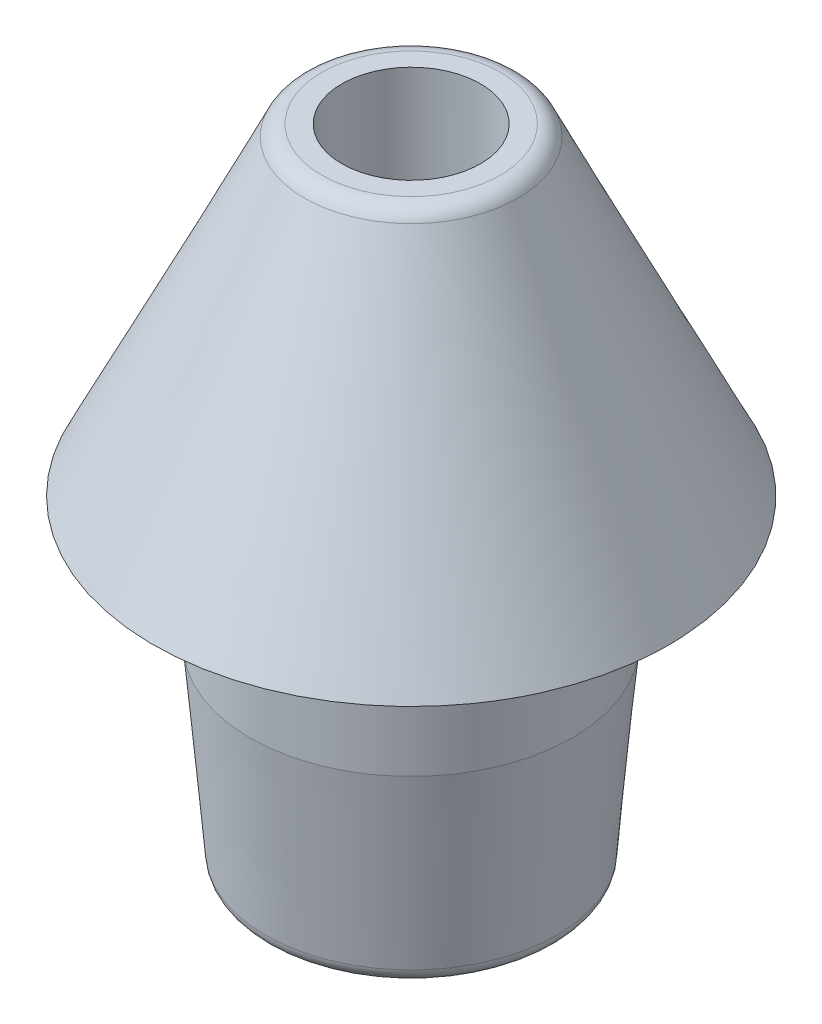
ISO-10303-21;
HEADER;
FILE_DESCRIPTION(('STEP AP214'),'2;1');
FILE_NAME('part.step','',(''),(''),'','','');
FILE_SCHEMA(('AUTOMOTIVE_DESIGN { 1 0 10303 214 1 1 1 1 }'));
ENDSEC;
DATA;
#1=APPLICATION_CONTEXT('core data for automotive mechanical design processes');
#2=APPLICATION_PROTOCOL_DEFINITION('international standard','automotive_design',2000,#1);
#3=PRODUCT_CONTEXT('',#1,'mechanical');
#4=PRODUCT('Part','Part','',(#3));
#5=PRODUCT_RELATED_PRODUCT_CATEGORY('part','',(#4));
#6=PRODUCT_DEFINITION_FORMATION('','',#4);
#7=PRODUCT_DEFINITION_CONTEXT('part definition',#1,'design');
#8=PRODUCT_DEFINITION('design','',#6,#7);
#9=PRODUCT_DEFINITION_SHAPE('','',#8);
#10=(LENGTH_UNIT() NAMED_UNIT(*) SI_UNIT(.MILLI.,.METRE.));
#11=(NAMED_UNIT(*) PLANE_ANGLE_UNIT() SI_UNIT($,.RADIAN.));
#12=(NAMED_UNIT(*) SI_UNIT($,.STERADIAN.) SOLID_ANGLE_UNIT());
#13=UNCERTAINTY_MEASURE_WITH_UNIT(LENGTH_MEASURE(1.E-05),#10,'distance_accuracy_value','');
#14=(GEOMETRIC_REPRESENTATION_CONTEXT(3) GLOBAL_UNCERTAINTY_ASSIGNED_CONTEXT((#13)) GLOBAL_UNIT_ASSIGNED_CONTEXT((#10,
#11,#12)) REPRESENTATION_CONTEXT('',''));
#15=CARTESIAN_POINT('',(0.,0.,0.));
#16=DIRECTION('',(0.,0.,1.));
#17=DIRECTION('',(1.,0.,0.));
#18=AXIS2_PLACEMENT_3D('',#15,#16,#17);
#19=CARTESIAN_POINT('',(0.,5.,0.));
#20=DIRECTION('',(0.,-1.,0.));
#21=DIRECTION('',(0.,0.,-1.));
#22=AXIS2_PLACEMENT_3D('',#19,#20,#21);
#23=CYLINDRICAL_SURFACE('',#22,2.5);
#24=CARTESIAN_POINT('',(0.,4.75,0.));
#25=DIRECTION('',(0.,1.,0.));
#26=DIRECTION('',(0.,0.,1.));
#27=AXIS2_PLACEMENT_3D('',#24,#25,#26);
#28=CIRCLE('',#27,2.5);
#29=CARTESIAN_POINT('',(0.,4.75,2.5));
#30=VERTEX_POINT('',#29);
#31=EDGE_CURVE('E59',#30,#30,#28,.F.);
#32=ORIENTED_EDGE('',*,*,#31,.T.);
#33=EDGE_LOOP('',(#32));
#34=FACE_BOUND('',#33,.T.);
#35=CARTESIAN_POINT('',(0.,3.00000000000009,0.));
#36=DIRECTION('',(0.,1.,0.));
#37=DIRECTION('',(0.,0.,1.));
#38=AXIS2_PLACEMENT_3D('',#35,#36,#37);
#39=CIRCLE('',#38,2.5);
#40=CARTESIAN_POINT('',(0.,3.00000000000009,2.5));
#41=VERTEX_POINT('',#40);
#42=EDGE_CURVE('E71',#41,#41,#39,.T.);
#43=ORIENTED_EDGE('',*,*,#42,.T.);
#44=EDGE_LOOP('',(#43));
#45=FACE_BOUND('',#44,.T.);
#46=ADVANCED_FACE('F39',(#34,#45),#23,.T.);
#47=CARTESIAN_POINT('',(0.,0.,0.));
#48=DIRECTION('',(0.,1.,0.));
#49=DIRECTION('',(0.,0.,1.));
#50=AXIS2_PLACEMENT_3D('',#47,#48,#49);
#51=PLANE('',#50);
#52=CARTESIAN_POINT('',(0.,0.,0.));
#53=DIRECTION('',(0.,1.,0.));
#54=DIRECTION('',(0.,0.,1.));
#55=AXIS2_PLACEMENT_3D('',#52,#53,#54);
#56=CIRCLE('',#55,1.61224114167871);
#57=CARTESIAN_POINT('',(0.,0.,1.61224114167871));
#58=VERTEX_POINT('',#57);
#59=EDGE_CURVE('E50',#58,#58,#56,.T.);
#60=ORIENTED_EDGE('',*,*,#59,.T.);
#61=EDGE_LOOP('',(#60));
#62=FACE_BOUND('',#61,.T.);
#63=CARTESIAN_POINT('',(0.,0.,0.));
#64=DIRECTION('',(0.,1.,0.));
#65=DIRECTION('',(0.,0.,1.));
#66=AXIS2_PLACEMENT_3D('',#63,#64,#65);
#67=CIRCLE('',#66,2.00845121591787);
#68=CARTESIAN_POINT('',(0.,0.,2.00845121591787));
#69=VERTEX_POINT('',#68);
#70=EDGE_CURVE('E54',#69,#69,#67,.F.);
#71=ORIENTED_EDGE('',*,*,#70,.T.);
#72=EDGE_LOOP('',(#71));
#73=FACE_BOUND('',#72,.T.);
#74=ADVANCED_FACE('F98',(#62,#73),#51,.F.);
#75=CARTESIAN_POINT('',(0.,5.,0.));
#76=DIRECTION('',(0.,1.,0.));
#77=DIRECTION('',(0.,0.,1.));
#78=AXIS2_PLACEMENT_3D('',#75,#76,#77);
#79=PLANE('',#78);
#80=CARTESIAN_POINT('',(0.,5.,0.));
#81=DIRECTION('',(0.,1.,0.));
#82=DIRECTION('',(0.,0.,1.));
#83=AXIS2_PLACEMENT_3D('',#80,#81,#82);
#84=CIRCLE('',#83,2.75);
#85=CARTESIAN_POINT('',(0.,5.,2.75));
#86=VERTEX_POINT('',#85);
#87=EDGE_CURVE('E62',#86,#86,#84,.T.);
#88=ORIENTED_EDGE('',*,*,#87,.T.);
#89=EDGE_LOOP('',(#88));
#90=FACE_BOUND('',#89,.T.);
#91=CARTESIAN_POINT('',(0.,5.,0.));
#92=DIRECTION('',(0.,1.,0.));
#93=DIRECTION('',(0.,0.,1.));
#94=AXIS2_PLACEMENT_3D('',#91,#92,#93);
#95=CIRCLE('',#94,4.);
#96=CARTESIAN_POINT('',(-3.8439673327907,5.,-1.10630698471897));
#97=VERTEX_POINT('',#96);
#98=EDGE_CURVE('E77',#97,#97,#95,.T.);
#99=ORIENTED_EDGE('',*,*,#98,.F.);
#100=EDGE_LOOP('',(#99));
#101=FACE_BOUND('',#100,.T.);
#102=ADVANCED_FACE('F89',(#90,#101),#79,.F.);
#103=CARTESIAN_POINT('',(0.,10.,0.));
#104=DIRECTION('',(0.,1.,0.));
#105=DIRECTION('',(0.,0.,1.));
#106=AXIS2_PLACEMENT_3D('',#103,#104,#105);
#107=PLANE('',#106);
#108=CARTESIAN_POINT('',(0.,10.,0.));
#109=DIRECTION('',(0.,1.,0.));
#110=DIRECTION('',(0.,0.,1.));
#111=AXIS2_PLACEMENT_3D('',#108,#109,#110);
#112=CIRCLE('',#111,1.384424869723);
#113=CARTESIAN_POINT('',(0.,10.,1.384424869723));
#114=VERTEX_POINT('',#113);
#115=EDGE_CURVE('E68',#114,#114,#112,.T.);
#116=ORIENTED_EDGE('',*,*,#115,.T.);
#117=EDGE_LOOP('',(#116));
#118=FACE_BOUND('',#117,.T.);
#119=CARTESIAN_POINT('',(0.,10.,0.));
#120=DIRECTION('',(0.,1.,0.));
#121=DIRECTION('',(0.,0.,1.));
#122=AXIS2_PLACEMENT_3D('',#119,#120,#121);
#123=CIRCLE('',#122,1.075);
#124=CARTESIAN_POINT('',(0.,10.,1.075));
#125=VERTEX_POINT('',#124);
#126=EDGE_CURVE('E80',#125,#125,#123,.T.);
#127=ORIENTED_EDGE('',*,*,#126,.F.);
#128=EDGE_LOOP('',(#127));
#129=FACE_BOUND('',#128,.T.);
#130=ADVANCED_FACE('F86',(#118,#129),#107,.T.);
#131=CARTESIAN_POINT('',(-1.39239365673616,10.,-0.736114736084607));
#132=CARTESIAN_POINT('',(-3.8439673327907,5.,-1.10630698471897));
#133=CARTESIAN_POINT('',(0.0798358154330552,10.,-3.52090204955692));
#134=CARTESIAN_POINT('',(-1.63135336335275,5.,-8.79424165030036));
#135=CARTESIAN_POINT('',(2.86462312890537,10.,-2.04867257738771));
#136=CARTESIAN_POINT('',(6.05658130222864,5.,-6.58162768086242));
#137=CARTESIAN_POINT('',(1.39239365673616,10.,0.736114736084607));
#138=CARTESIAN_POINT('',(3.8439673327907,5.,1.10630698471897));
#139=CARTESIAN_POINT('',(-0.0798358154330547,10.,3.52090204955692));
#140=CARTESIAN_POINT('',(1.63135336335275,5.,8.79424165030036));
#141=CARTESIAN_POINT('',(-2.86462312890537,10.,2.04867257738771));
#142=CARTESIAN_POINT('',(-6.05658130222864,5.,6.58162768086242));
#143=CARTESIAN_POINT('',(-1.39239365673616,10.,-0.736114736084607));
#144=CARTESIAN_POINT('',(-3.8439673327907,5.,-1.10630698471897));
#145=(BOUNDED_SURFACE() B_SPLINE_SURFACE(3,1,((#131,#132),(#133,#134),(#135,#136),(#137,#138),
(#139,#140),(#141,#142),(#143,#144)),.UNSPECIFIED.,.T.,.F.,.F.) B_SPLINE_SURFACE_WITH_KNOTS((4,
3,4),(2,2),(0.,0.5,1.),(0.,1.),
.UNSPECIFIED.) GEOMETRIC_REPRESENTATION_ITEM() RATIONAL_B_SPLINE_SURFACE(((1.,1.),
(0.333333333333333,0.333333333333333),(0.333333333333333,0.333333333333333),(1.,1.),
(0.333333333333333,0.333333333333333),(0.333333333333333,0.333333333333333),(1.,1.))) REPRESENTATION_ITEM('') SURFACE());
#146=CARTESIAN_POINT('',(0.,9.82778405628968,0.));
#147=DIRECTION('',(0.,-1.,0.));
#148=DIRECTION('',(0.,0.,-1.));
#149=AXIS2_PLACEMENT_3D('',#146,#147,#148);
#150=CIRCLE('',#149,1.65584932506583);
#151=CARTESIAN_POINT('',(-1.47683367157558,9.82778405628968,-0.748865337575169));
#152=VERTEX_POINT('',#151);
#153=EDGE_CURVE('E65',#152,#152,#150,.T.);
#154=CARTESIAN_POINT('',(-1.47683367157558,9.82778405628968,-0.748865337575169));
#155=CARTESIAN_POINT('',(-1.5014913138799,9.77749463903666,-0.75258868806625));
#156=CARTESIAN_POINT('',(-1.52614895618423,9.72720522178365,-0.756312038557332));
#157=CARTESIAN_POINT('',(-1.57546424079288,9.62662638727761,-0.763758739539494));
#158=CARTESIAN_POINT('',(-1.6001218830972,9.5763369700246,-0.767482090030576));
#159=CARTESIAN_POINT('',(-1.64943716770585,9.47575813551856,-0.774928791012738));
#160=CARTESIAN_POINT('',(-1.67409481001017,9.42546871826554,-0.778652141503819));
#161=CARTESIAN_POINT('',(-1.72341009461882,9.32488988375951,-0.786098842485982));
#162=CARTESIAN_POINT('',(-1.74806773692314,9.27460046650649,-0.789822192977063));
#163=CARTESIAN_POINT('',(-1.79738302153179,9.17402163200046,-0.797268893959226));
#164=CARTESIAN_POINT('',(-1.82204066383612,9.12373221474744,-0.800992244450307));
#165=CARTESIAN_POINT('',(-1.87135594844477,9.0231533802414,-0.80843894543247));
#166=CARTESIAN_POINT('',(-1.89601359074909,8.97286396298838,-0.812162295923551));
#167=CARTESIAN_POINT('',(-1.94532887535774,8.87228512848235,-0.819608996905713));
#168=CARTESIAN_POINT('',(-1.96998651766206,8.82199571122933,-0.823332347396795));
#169=CARTESIAN_POINT('',(-2.01930180227071,8.7214168767233,-0.830779048378957));
#170=CARTESIAN_POINT('',(-2.04395944457504,8.67112745947028,-0.834502398870039));
#171=CARTESIAN_POINT('',(-2.09327472918368,8.57054862496424,-0.841949099852201));
#172=CARTESIAN_POINT('',(-2.11793237148801,8.52025920771123,-0.845672450343282));
#173=CARTESIAN_POINT('',(-2.16724765609665,8.41968037320519,-0.853119151325445));
#174=CARTESIAN_POINT('',(-2.19190529840098,8.36939095595217,-0.856842501816526));
#175=CARTESIAN_POINT('',(-2.24122058300963,8.26881212144614,-0.864289202798689));
#176=CARTESIAN_POINT('',(-2.26587822531395,8.21852270419312,-0.86801255328977));
#177=CARTESIAN_POINT('',(-2.3151935099226,8.11794386968709,-0.875459254271932));
#178=CARTESIAN_POINT('',(-2.33985115222692,8.06765445243407,-0.879182604763014));
#179=CARTESIAN_POINT('',(-2.38916643683557,7.96707561792803,-0.886629305745176));
#180=CARTESIAN_POINT('',(-2.4138240791399,7.91678620067502,-0.890352656236258));
#181=CARTESIAN_POINT('',(-2.46313936374854,7.81620736616898,-0.89779935721842));
#182=CARTESIAN_POINT('',(-2.48779700605287,7.76591794891596,-0.901522707709501));
#183=CARTESIAN_POINT('',(-2.53711229066152,7.66533911440993,-0.908969408691664));
#184=CARTESIAN_POINT('',(-2.56176993296584,7.61504969715691,-0.912692759182745));
#185=CARTESIAN_POINT('',(-2.61108521757449,7.51447086265088,-0.920139460164908));
#186=CARTESIAN_POINT('',(-2.63574285987881,7.46418144539786,-0.923862810655989));
#187=CARTESIAN_POINT('',(-2.68505814448746,7.36360261089182,-0.931309511638152));
#188=CARTESIAN_POINT('',(-2.70971578679179,7.31331319363881,-0.935032862129233));
#189=CARTESIAN_POINT('',(-2.75903107140043,7.21273435913277,-0.942479563111395));
#190=CARTESIAN_POINT('',(-2.78368871370476,7.16244494187975,-0.946202913602477));
#191=CARTESIAN_POINT('',(-2.83300399831341,7.06186610737372,-0.953649614584639));
#192=CARTESIAN_POINT('',(-2.85766164061773,7.0115766901207,-0.957372965075721));
#193=CARTESIAN_POINT('',(-2.90697692522638,6.91099785561467,-0.964819666057883));
#194=CARTESIAN_POINT('',(-2.9316345675307,6.86070843836165,-0.968543016548965));
#195=CARTESIAN_POINT('',(-2.98094985213935,6.76012960385561,-0.975989717531127));
#196=CARTESIAN_POINT('',(-3.00560749444368,6.7098401866026,-0.979713068022208));
#197=CARTESIAN_POINT('',(-3.05492277905232,6.60926135209656,-0.987159769004371));
#198=CARTESIAN_POINT('',(-3.07958042135665,6.55897193484354,-0.990883119495452));
#199=CARTESIAN_POINT('',(-3.1288957059653,6.45839310033751,-0.998329820477615));
#200=CARTESIAN_POINT('',(-3.15355334826962,6.40810368308449,-1.0020531709687));
#201=CARTESIAN_POINT('',(-3.20286863287827,6.30752484857846,-1.00949987195086));
#202=CARTESIAN_POINT('',(-3.22752627518259,6.25723543132544,-1.01322322244194));
#203=CARTESIAN_POINT('',(-3.27684155979124,6.1566565968194,-1.0206699234241));
#204=CARTESIAN_POINT('',(-3.30149920209557,6.10636717956639,-1.02439327391518));
#205=CARTESIAN_POINT('',(-3.35081448670421,6.00578834506035,-1.03183997489735));
#206=CARTESIAN_POINT('',(-3.37547212900854,5.95549892780733,-1.03556332538843));
#207=CARTESIAN_POINT('',(-3.42478741361719,5.8549200933013,-1.04301002637059));
#208=CARTESIAN_POINT('',(-3.44944505592151,5.80463067604828,-1.04673337686167));
#209=CARTESIAN_POINT('',(-3.49876034053016,5.70405184154225,-1.05418007784383));
#210=CARTESIAN_POINT('',(-3.52341798283448,5.65376242428923,-1.05790342833492));
#211=CARTESIAN_POINT('',(-3.57273326744313,5.55318358978319,-1.06535012931708));
#212=CARTESIAN_POINT('',(-3.59739090974745,5.50289417253018,-1.06907347980816));
#213=CARTESIAN_POINT('',(-3.6467061943561,5.40231533802414,-1.07652018079032));
#214=CARTESIAN_POINT('',(-3.67136383666043,5.35202592077112,-1.0802435312814));
#215=CARTESIAN_POINT('',(-3.72067912126908,5.25144708626509,-1.08769023226357));
#216=CARTESIAN_POINT('',(-3.7453367635734,5.20115766901207,-1.09141358275465));
#217=CARTESIAN_POINT('',(-3.79465204818205,5.10057883450604,-1.09886028373681));
#218=CARTESIAN_POINT('',(-3.81930969048637,5.05028941725302,-1.10258363422789));
#219=CARTESIAN_POINT('',(-3.8439673327907,5.,-1.10630698471897));
#220=B_SPLINE_CURVE_WITH_KNOTS('',3,(#154,#155,#156,#157,#158,#159,#160,#161,#162,#163,#164,
#165,#166,#167,#168,#169,#170,#171,#172,#173,#174,#175,#176,#177,#178,#179,#180,#181,#182,#183,
#184,#185,#186,#187,#188,#189,#190,#191,#192,#193,#194,#195,#196,#197,#198,#199,#200,#201,#202,
#203,#204,#205,#206,#207,#208,#209,#210,#211,#212,#213,#214,#215,#216,#217,#218,#219),
.UNSPECIFIED.,.F.,.F.,(4,2,2,2,2,2,2,2,2,2,2,2,2,2,2,2,2,2,2,2,2,2,2,2,2,2,2,2,2,2,2,2,4),(0.,
0.168398317553411,0.336796635106821,0.505194952660235,0.673593270213646,0.841991587767058,
1.01038990532047,1.17878822287388,1.34718654042729,1.51558485798071,1.68398317553412,
1.85238149308753,2.02077981064094,2.18917812819435,2.35757644574777,2.52597476330118,
2.69437308085459,2.862771398408,3.03116971596141,3.19956803351482,3.36796635106824,
3.53636466862165,3.70476298617506,3.87316130372847,4.04155962128188,4.2099579388353,
4.37835625638871,4.54675457394212,4.71515289149553,4.88355120904894,5.05194952660236,
5.22034784415577,5.38874616170918),.UNSPECIFIED.);
#221=EDGE_CURVE('BSEAM88',#152,#97,#220,.T.);
#222=ORIENTED_EDGE('',*,*,#153,.T.);
#223=ORIENTED_EDGE('',*,*,#98,.T.);
#224=ORIENTED_EDGE('',*,*,#221,.T.);
#225=ORIENTED_EDGE('',*,*,#221,.F.);
#226=EDGE_LOOP('',(#222,#224,#223,#225));
#227=FACE_BOUND('',#226,.T.);
#228=ADVANCED_FACE('F88',(#227),#145,.T.);
#229=CARTESIAN_POINT('',(0.,0.,0.));
#230=DIRECTION('',(0.,1.,0.));
#231=DIRECTION('',(0.,0.,1.));
#232=AXIS2_PLACEMENT_3D('',#229,#230,#231);
#233=CYLINDRICAL_SURFACE('',#232,1.075);
#234=CARTESIAN_POINT('',(0.,5.72434100631815,0.));
#235=DIRECTION('',(0.,1.,0.));
#236=DIRECTION('',(0.,0.,1.));
#237=AXIS2_PLACEMENT_3D('',#234,#235,#236);
#238=CIRCLE('',#237,1.075);
#239=CARTESIAN_POINT('',(0.,5.72434100631815,1.075));
#240=VERTEX_POINT('',#239);
#241=EDGE_CURVE('E74',#240,#240,#238,.F.);
#242=ORIENTED_EDGE('',*,*,#241,.T.);
#243=EDGE_LOOP('',(#242));
#244=FACE_BOUND('',#243,.T.);
#245=ORIENTED_EDGE('',*,*,#126,.T.);
#246=EDGE_LOOP('',(#245));
#247=FACE_BOUND('',#246,.T.);
#248=ADVANCED_FACE('F84',(#244,#247),#233,.F.);
#249=CARTESIAN_POINT('',(0.,0.,0.));
#250=DIRECTION('',(0.,-1.,0.));
#251=DIRECTION('',(0.,0.,-1.));
#252=AXIS2_PLACEMENT_3D('',#249,#250,#251);
#253=CONICAL_SURFACE('',#252,1.37499999999999,0.0523598775598306);
#254=CARTESIAN_POINT('',(0.,0.236916010939264,0.));
#255=DIRECTION('',(0.,-1.,0.));
#256=DIRECTION('',(0.,0.,-1.));
#257=AXIS2_PLACEMENT_3D('',#254,#255,#256);
#258=CIRCLE('',#257,1.36258375799006);
#259=CARTESIAN_POINT('',(0.,0.236916010939264,-1.36258375799006));
#260=VERTEX_POINT('',#259);
#261=EDGE_CURVE('E46',#260,#260,#258,.T.);
#262=ORIENTED_EDGE('',*,*,#261,.T.);
#263=EDGE_LOOP('',(#262));
#264=FACE_BOUND('',#263,.T.);
#265=ORIENTED_EDGE('',*,*,#241,.F.);
#266=EDGE_LOOP('',(#265));
#267=FACE_BOUND('',#266,.T.);
#268=ADVANCED_FACE('F112',(#264,#267),#253,.F.);
#269=CARTESIAN_POINT('',(0.,3.00000000000009,0.));
#270=DIRECTION('',(0.,1.,0.));
#271=DIRECTION('',(0.,0.,1.));
#272=AXIS2_PLACEMENT_3D('',#269,#270,#271);
#273=CONICAL_SURFACE('',#272,2.5,0.0872664625997141);
#274=CARTESIAN_POINT('',(0.,0.228211064313086,0.));
#275=DIRECTION('',(0.,1.,0.));
#276=DIRECTION('',(0.,0.,1.));
#277=AXIS2_PLACEMENT_3D('',#274,#275,#276);
#278=CIRCLE('',#277,2.25749989044081);
#279=CARTESIAN_POINT('',(0.,0.228211064313086,2.25749989044081));
#280=VERTEX_POINT('',#279);
#281=EDGE_CURVE('E11',#280,#280,#278,.T.);
#282=ORIENTED_EDGE('',*,*,#281,.T.);
#283=EDGE_LOOP('',(#282));
#284=FACE_BOUND('',#283,.T.);
#285=ORIENTED_EDGE('',*,*,#42,.F.);
#286=EDGE_LOOP('',(#285));
#287=FACE_BOUND('',#286,.T.);
#288=ADVANCED_FACE('F115',(#284,#287),#273,.T.);
#289=CARTESIAN_POINT('',(0.,9.7,0.));
#290=DIRECTION('',(0.,-1.,0.));
#291=DIRECTION('',(0.,0.,-1.));
#292=AXIS2_PLACEMENT_3D('',#289,#290,#291);
#293=TOROIDAL_SURFACE('',#292,1.384424869723,0.3);
#294=ORIENTED_EDGE('',*,*,#153,.F.);
#295=EDGE_LOOP('',(#294));
#296=FACE_BOUND('',#295,.T.);
#297=ORIENTED_EDGE('',*,*,#115,.F.);
#298=EDGE_LOOP('',(#297));
#299=FACE_BOUND('',#298,.T.);
#300=ADVANCED_FACE('F118',(#296,#299),#293,.T.);
#301=CARTESIAN_POINT('',(0.,4.75,0.));
#302=DIRECTION('',(0.,1.,0.));
#303=DIRECTION('',(0.,0.,1.));
#304=AXIS2_PLACEMENT_3D('',#301,#302,#303);
#305=TOROIDAL_SURFACE('',#304,2.75,0.25);
#306=ORIENTED_EDGE('',*,*,#31,.F.);
#307=EDGE_LOOP('',(#306));
#308=FACE_BOUND('',#307,.T.);
#309=ORIENTED_EDGE('',*,*,#87,.F.);
#310=EDGE_LOOP('',(#309));
#311=FACE_BOUND('',#310,.T.);
#312=ADVANCED_FACE('F121',(#308,#311),#305,.F.);
#313=CARTESIAN_POINT('',(0.,0.25,0.));
#314=DIRECTION('',(0.,1.,0.));
#315=DIRECTION('',(0.,0.,1.));
#316=AXIS2_PLACEMENT_3D('',#313,#314,#315);
#317=TOROIDAL_SURFACE('',#316,1.61224114167871,0.25);
#318=ORIENTED_EDGE('',*,*,#261,.F.);
#319=EDGE_LOOP('',(#318));
#320=FACE_BOUND('',#319,.T.);
#321=ORIENTED_EDGE('',*,*,#59,.F.);
#322=EDGE_LOOP('',(#321));
#323=FACE_BOUND('',#322,.T.);
#324=ADVANCED_FACE('F124',(#320,#323),#317,.T.);
#325=CARTESIAN_POINT('',(0.,0.25,0.));
#326=DIRECTION('',(0.,1.,0.));
#327=DIRECTION('',(0.,0.,1.));
#328=AXIS2_PLACEMENT_3D('',#325,#326,#327);
#329=TOROIDAL_SURFACE('',#328,2.00845121591787,0.25);
#330=ORIENTED_EDGE('',*,*,#281,.F.);
#331=EDGE_LOOP('',(#330));
#332=FACE_BOUND('',#331,.T.);
#333=ORIENTED_EDGE('',*,*,#70,.F.);
#334=EDGE_LOOP('',(#333));
#335=FACE_BOUND('',#334,.T.);
#336=ADVANCED_FACE('F41',(#332,#335),#329,.T.);
#337=CLOSED_SHELL('',(#46,#74,#102,#130,#228,#248,#268,#288,#300,#312,#324,#336));
#338=MANIFOLD_SOLID_BREP('B2',#337);
#339=ADVANCED_BREP_SHAPE_REPRESENTATION('',(#18,#338),#14);
#340=SHAPE_DEFINITION_REPRESENTATION(#9,#339);
ENDSEC;
END-ISO-10303-21;
